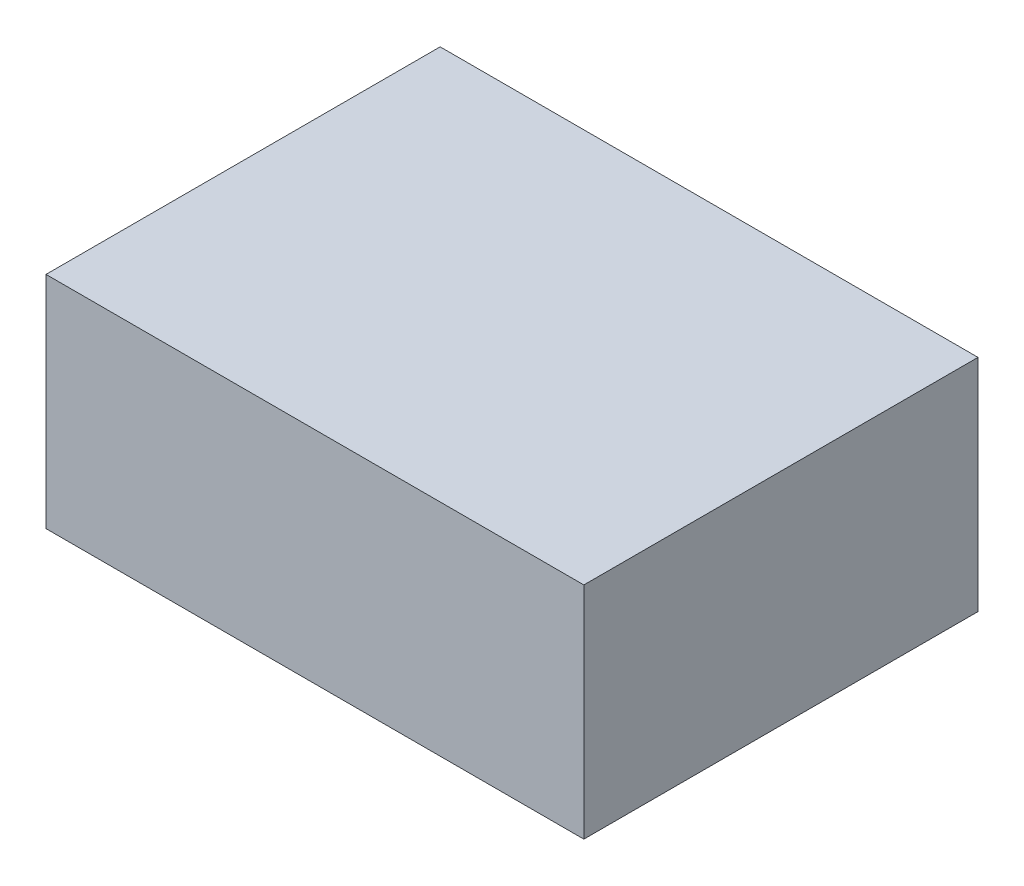
ISO-10303-21;
HEADER;
FILE_DESCRIPTION(('STEP AP214'),'2;1');
FILE_NAME('part.step','',(''),(''),'','','');
FILE_SCHEMA(('AUTOMOTIVE_DESIGN { 1 0 10303 214 1 1 1 1 }'));
ENDSEC;
DATA;
#1=APPLICATION_CONTEXT('core data for automotive mechanical design processes');
#2=APPLICATION_PROTOCOL_DEFINITION('international standard','automotive_design',2000,#1);
#3=PRODUCT_CONTEXT('',#1,'mechanical');
#4=PRODUCT('Part','Part','',(#3));
#5=PRODUCT_RELATED_PRODUCT_CATEGORY('part','',(#4));
#6=PRODUCT_DEFINITION_FORMATION('','',#4);
#7=PRODUCT_DEFINITION_CONTEXT('part definition',#1,'design');
#8=PRODUCT_DEFINITION('design','',#6,#7);
#9=PRODUCT_DEFINITION_SHAPE('','',#8);
#10=(LENGTH_UNIT() NAMED_UNIT(*) SI_UNIT(.MILLI.,.METRE.));
#11=(NAMED_UNIT(*) PLANE_ANGLE_UNIT() SI_UNIT($,.RADIAN.));
#12=(NAMED_UNIT(*) SI_UNIT($,.STERADIAN.) SOLID_ANGLE_UNIT());
#13=UNCERTAINTY_MEASURE_WITH_UNIT(LENGTH_MEASURE(1.E-05),#10,'distance_accuracy_value','');
#14=(GEOMETRIC_REPRESENTATION_CONTEXT(3) GLOBAL_UNCERTAINTY_ASSIGNED_CONTEXT((#13)) GLOBAL_UNIT_ASSIGNED_CONTEXT((#10,
#11,#12)) REPRESENTATION_CONTEXT('',''));
#15=CARTESIAN_POINT('',(0.,0.,0.));
#16=DIRECTION('',(0.,0.,1.));
#17=DIRECTION('',(1.,0.,0.));
#18=AXIS2_PLACEMENT_3D('',#15,#16,#17);
#19=CARTESIAN_POINT('',(32.,-13.1,46.9));
#20=DIRECTION('',(-1.,0.,0.));
#21=DIRECTION('',(0.,0.,1.));
#22=AXIS2_PLACEMENT_3D('',#19,#20,#21);
#23=PLANE('',#22);
#24=DIRECTION('',(0.,1.,0.));
#25=VECTOR('',#24,1.);
#26=CARTESIAN_POINT('',(32.,-13.1,0.));
#27=LINE('',#26,#25);
#28=CARTESIAN_POINT('',(32.,-13.1,0.));
#29=VERTEX_POINT('',#28);
#30=CARTESIAN_POINT('',(32.,13.1,0.));
#31=VERTEX_POINT('',#30);
#32=EDGE_CURVE('E102',#29,#31,#27,.T.);
#33=ORIENTED_EDGE('',*,*,#32,.T.);
#34=DIRECTION('',(0.,0.,-1.));
#35=VECTOR('',#34,1.);
#36=CARTESIAN_POINT('',(32.,13.1,46.9));
#37=LINE('',#36,#35);
#38=CARTESIAN_POINT('',(32.,13.1,46.9));
#39=VERTEX_POINT('',#38);
#40=EDGE_CURVE('E11',#39,#31,#37,.T.);
#41=ORIENTED_EDGE('',*,*,#40,.F.);
#42=DIRECTION('',(0.,1.,0.));
#43=VECTOR('',#42,1.);
#44=CARTESIAN_POINT('',(32.,-13.1,46.9));
#45=LINE('',#44,#43);
#46=CARTESIAN_POINT('',(32.,-13.1,46.9));
#47=VERTEX_POINT('',#46);
#48=EDGE_CURVE('E90',#47,#39,#45,.T.);
#49=ORIENTED_EDGE('',*,*,#48,.F.);
#50=DIRECTION('',(0.,0.,-1.));
#51=VECTOR('',#50,1.);
#52=CARTESIAN_POINT('',(32.,-13.1,46.9));
#53=LINE('',#52,#51);
#54=EDGE_CURVE('E98',#47,#29,#53,.T.);
#55=ORIENTED_EDGE('',*,*,#54,.T.);
#56=EDGE_LOOP('',(#33,#41,#49,#55));
#57=FACE_BOUND('',#56,.T.);
#58=ADVANCED_FACE('F39',(#57),#23,.F.);
#59=CARTESIAN_POINT('',(-32.,13.1,46.9));
#60=DIRECTION('',(0.,-1.,0.));
#61=DIRECTION('',(0.,0.,-1.));
#62=AXIS2_PLACEMENT_3D('',#59,#60,#61);
#63=PLANE('',#62);
#64=DIRECTION('',(-1.,0.,0.));
#65=VECTOR('',#64,1.);
#66=CARTESIAN_POINT('',(-32.,13.1,0.));
#67=LINE('',#66,#65);
#68=CARTESIAN_POINT('',(-32.,13.1,0.));
#69=VERTEX_POINT('',#68);
#70=EDGE_CURVE('E94',#31,#69,#67,.T.);
#71=ORIENTED_EDGE('',*,*,#70,.T.);
#72=DIRECTION('',(0.,0.,-1.));
#73=VECTOR('',#72,1.);
#74=CARTESIAN_POINT('',(-32.,13.1,46.9));
#75=LINE('',#74,#73);
#76=CARTESIAN_POINT('',(-32.,13.1,46.9));
#77=VERTEX_POINT('',#76);
#78=EDGE_CURVE('E47',#77,#69,#75,.T.);
#79=ORIENTED_EDGE('',*,*,#78,.F.);
#80=DIRECTION('',(-1.,0.,0.));
#81=VECTOR('',#80,1.);
#82=CARTESIAN_POINT('',(-32.,13.1,46.9));
#83=LINE('',#82,#81);
#84=EDGE_CURVE('E85',#39,#77,#83,.T.);
#85=ORIENTED_EDGE('',*,*,#84,.F.);
#86=ORIENTED_EDGE('',*,*,#40,.T.);
#87=EDGE_LOOP('',(#71,#79,#85,#86));
#88=FACE_BOUND('',#87,.T.);
#89=ADVANCED_FACE('F93',(#88),#63,.F.);
#90=CARTESIAN_POINT('',(-32.,-13.1,46.9));
#91=DIRECTION('',(1.,0.,0.));
#92=DIRECTION('',(0.,0.,-1.));
#93=AXIS2_PLACEMENT_3D('',#90,#91,#92);
#94=PLANE('',#93);
#95=DIRECTION('',(0.,-1.,0.));
#96=VECTOR('',#95,1.);
#97=CARTESIAN_POINT('',(-32.,-13.1,0.));
#98=LINE('',#97,#96);
#99=CARTESIAN_POINT('',(-32.,-13.1,0.));
#100=VERTEX_POINT('',#99);
#101=EDGE_CURVE('E72',#69,#100,#98,.T.);
#102=ORIENTED_EDGE('',*,*,#101,.T.);
#103=DIRECTION('',(0.,0.,-1.));
#104=VECTOR('',#103,1.);
#105=CARTESIAN_POINT('',(-32.,-13.1,46.9));
#106=LINE('',#105,#104);
#107=CARTESIAN_POINT('',(-32.,-13.1,46.9));
#108=VERTEX_POINT('',#107);
#109=EDGE_CURVE('E95',#108,#100,#106,.T.);
#110=ORIENTED_EDGE('',*,*,#109,.F.);
#111=DIRECTION('',(0.,-1.,0.));
#112=VECTOR('',#111,1.);
#113=CARTESIAN_POINT('',(-32.,-13.1,46.9));
#114=LINE('',#113,#112);
#115=EDGE_CURVE('E88',#77,#108,#114,.T.);
#116=ORIENTED_EDGE('',*,*,#115,.F.);
#117=ORIENTED_EDGE('',*,*,#78,.T.);
#118=EDGE_LOOP('',(#102,#110,#116,#117));
#119=FACE_BOUND('',#118,.T.);
#120=ADVANCED_FACE('F96',(#119),#94,.F.);
#121=CARTESIAN_POINT('',(-32.,-13.1,46.9));
#122=DIRECTION('',(0.,1.,0.));
#123=DIRECTION('',(0.,0.,1.));
#124=AXIS2_PLACEMENT_3D('',#121,#122,#123);
#125=PLANE('',#124);
#126=DIRECTION('',(1.,0.,0.));
#127=VECTOR('',#126,1.);
#128=CARTESIAN_POINT('',(-32.,-13.1,0.));
#129=LINE('',#128,#127);
#130=EDGE_CURVE('E78',#100,#29,#129,.T.);
#131=ORIENTED_EDGE('',*,*,#130,.T.);
#132=ORIENTED_EDGE('',*,*,#54,.F.);
#133=DIRECTION('',(1.,0.,0.));
#134=VECTOR('',#133,1.);
#135=CARTESIAN_POINT('',(-32.,-13.1,46.9));
#136=LINE('',#135,#134);
#137=EDGE_CURVE('E55',#108,#47,#136,.T.);
#138=ORIENTED_EDGE('',*,*,#137,.F.);
#139=ORIENTED_EDGE('',*,*,#109,.T.);
#140=EDGE_LOOP('',(#131,#132,#138,#139));
#141=FACE_BOUND('',#140,.T.);
#142=ADVANCED_FACE('F109',(#141),#125,.F.);
#143=CARTESIAN_POINT('',(0.,0.,46.9));
#144=DIRECTION('',(0.,0.,-1.));
#145=DIRECTION('',(-1.,0.,0.));
#146=AXIS2_PLACEMENT_3D('',#143,#144,#145);
#147=PLANE('',#146);
#148=ORIENTED_EDGE('',*,*,#48,.T.);
#149=ORIENTED_EDGE('',*,*,#84,.T.);
#150=ORIENTED_EDGE('',*,*,#115,.T.);
#151=ORIENTED_EDGE('',*,*,#137,.T.);
#152=EDGE_LOOP('',(#148,#149,#150,#151));
#153=FACE_BOUND('',#152,.T.);
#154=ADVANCED_FACE('F86',(#153),#147,.F.);
#155=CARTESIAN_POINT('',(0.,0.,0.));
#156=DIRECTION('',(0.,0.,-1.));
#157=DIRECTION('',(-1.,0.,0.));
#158=AXIS2_PLACEMENT_3D('',#155,#156,#157);
#159=PLANE('',#158);
#160=ORIENTED_EDGE('',*,*,#32,.F.);
#161=ORIENTED_EDGE('',*,*,#130,.F.);
#162=ORIENTED_EDGE('',*,*,#101,.F.);
#163=ORIENTED_EDGE('',*,*,#70,.F.);
#164=EDGE_LOOP('',(#160,#161,#162,#163));
#165=FACE_BOUND('',#164,.T.);
#166=ADVANCED_FACE('F112',(#165),#159,.T.);
#167=CLOSED_SHELL('',(#58,#89,#120,#142,#154,#166));
#168=MANIFOLD_SOLID_BREP('B2',#167);
#169=ADVANCED_BREP_SHAPE_REPRESENTATION('',(#18,#168),#14);
#170=SHAPE_DEFINITION_REPRESENTATION(#9,#169);
ENDSEC;
END-ISO-10303-21;
